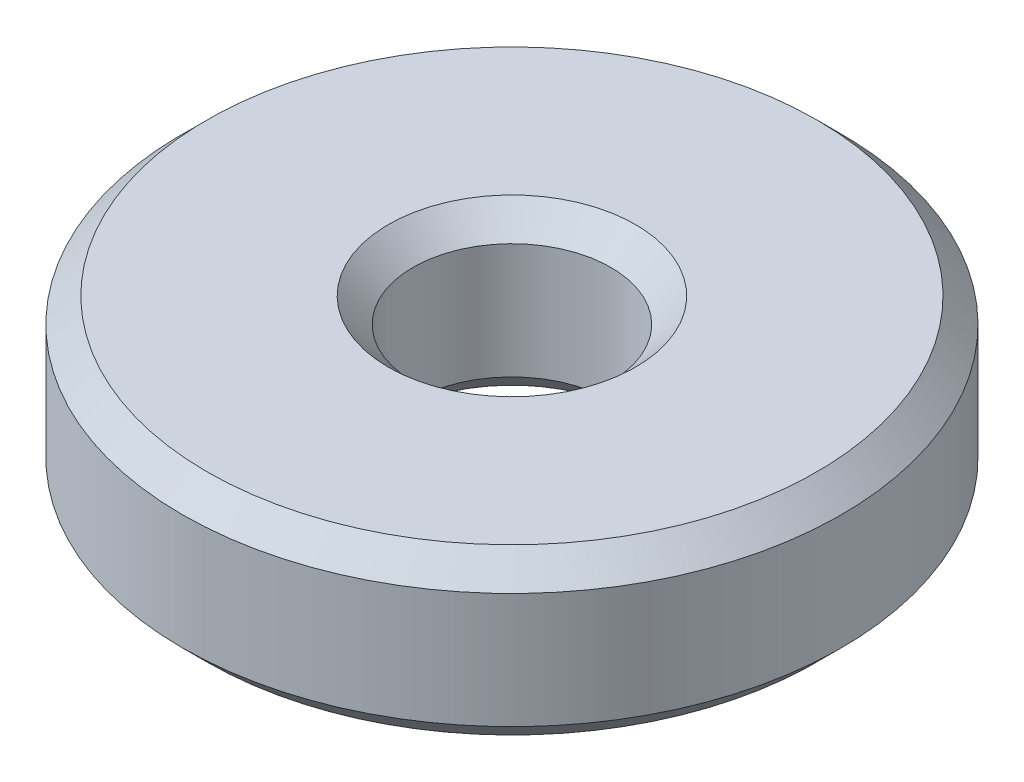
ISO-10303-21;
HEADER;
FILE_DESCRIPTION(('STEP AP214'),'2;1');
FILE_NAME('part.step','',(''),(''),'','','');
FILE_SCHEMA(('AUTOMOTIVE_DESIGN { 1 0 10303 214 1 1 1 1 }'));
ENDSEC;
DATA;
#1=APPLICATION_CONTEXT('core data for automotive mechanical design processes');
#2=APPLICATION_PROTOCOL_DEFINITION('international standard','automotive_design',2000,#1);
#3=PRODUCT_CONTEXT('',#1,'mechanical');
#4=PRODUCT('Part','Part','',(#3));
#5=PRODUCT_RELATED_PRODUCT_CATEGORY('part','',(#4));
#6=PRODUCT_DEFINITION_FORMATION('','',#4);
#7=PRODUCT_DEFINITION_CONTEXT('part definition',#1,'design');
#8=PRODUCT_DEFINITION('design','',#6,#7);
#9=PRODUCT_DEFINITION_SHAPE('','',#8);
#10=(LENGTH_UNIT() NAMED_UNIT(*) SI_UNIT(.MILLI.,.METRE.));
#11=(NAMED_UNIT(*) PLANE_ANGLE_UNIT() SI_UNIT($,.RADIAN.));
#12=(NAMED_UNIT(*) SI_UNIT($,.STERADIAN.) SOLID_ANGLE_UNIT());
#13=UNCERTAINTY_MEASURE_WITH_UNIT(LENGTH_MEASURE(1.E-05),#10,'distance_accuracy_value','');
#14=(GEOMETRIC_REPRESENTATION_CONTEXT(3) GLOBAL_UNCERTAINTY_ASSIGNED_CONTEXT((#13)) GLOBAL_UNIT_ASSIGNED_CONTEXT((#10,
#11,#12)) REPRESENTATION_CONTEXT('',''));
#15=CARTESIAN_POINT('',(0.,0.,0.));
#16=DIRECTION('',(0.,0.,1.));
#17=DIRECTION('',(1.,0.,0.));
#18=AXIS2_PLACEMENT_3D('',#15,#16,#17);
#19=CARTESIAN_POINT('',(0.,5.,0.));
#20=DIRECTION('',(0.,1.,0.));
#21=DIRECTION('',(0.,0.,1.));
#22=AXIS2_PLACEMENT_3D('',#19,#20,#21);
#23=PLANE('',#22);
#24=CARTESIAN_POINT('',(0.,5.,0.));
#25=DIRECTION('',(0.,1.,0.));
#26=DIRECTION('',(0.,0.,1.));
#27=AXIS2_PLACEMENT_3D('',#24,#25,#26);
#28=CIRCLE('',#27,3.75);
#29=CARTESIAN_POINT('',(0.,5.,3.75));
#30=VERTEX_POINT('',#29);
#31=EDGE_CURVE('E49',#30,#30,#28,.F.);
#32=ORIENTED_EDGE('',*,*,#31,.T.);
#33=EDGE_LOOP('',(#32));
#34=FACE_BOUND('',#33,.T.);
#35=CARTESIAN_POINT('',(0.,5.,0.));
#36=DIRECTION('',(0.,1.,0.));
#37=DIRECTION('',(0.,0.,1.));
#38=AXIS2_PLACEMENT_3D('',#35,#36,#37);
#39=CIRCLE('',#38,9.24999999999999);
#40=CARTESIAN_POINT('',(0.,5.,9.24999999999999));
#41=VERTEX_POINT('',#40);
#42=EDGE_CURVE('E54',#41,#41,#39,.T.);
#43=ORIENTED_EDGE('',*,*,#42,.T.);
#44=EDGE_LOOP('',(#43));
#45=FACE_BOUND('',#44,.T.);
#46=ADVANCED_FACE('F36',(#34,#45),#23,.T.);
#47=CARTESIAN_POINT('',(0.,0.,0.));
#48=DIRECTION('',(0.,1.,0.));
#49=DIRECTION('',(0.,0.,1.));
#50=AXIS2_PLACEMENT_3D('',#47,#48,#49);
#51=PLANE('',#50);
#52=CARTESIAN_POINT('',(0.,0.,0.));
#53=DIRECTION('',(0.,1.,0.));
#54=DIRECTION('',(0.,0.,1.));
#55=AXIS2_PLACEMENT_3D('',#52,#53,#54);
#56=CIRCLE('',#55,3.75);
#57=CARTESIAN_POINT('',(0.,0.,3.75));
#58=VERTEX_POINT('',#57);
#59=EDGE_CURVE('E68',#58,#58,#56,.T.);
#60=ORIENTED_EDGE('',*,*,#59,.T.);
#61=EDGE_LOOP('',(#60));
#62=FACE_BOUND('',#61,.T.);
#63=CARTESIAN_POINT('',(0.,0.,0.));
#64=DIRECTION('',(0.,1.,0.));
#65=DIRECTION('',(0.,0.,1.));
#66=AXIS2_PLACEMENT_3D('',#63,#64,#65);
#67=CIRCLE('',#66,9.25);
#68=CARTESIAN_POINT('',(0.,0.,9.25));
#69=VERTEX_POINT('',#68);
#70=EDGE_CURVE('E72',#69,#69,#67,.F.);
#71=ORIENTED_EDGE('',*,*,#70,.T.);
#72=EDGE_LOOP('',(#71));
#73=FACE_BOUND('',#72,.T.);
#74=ADVANCED_FACE('F77',(#62,#73),#51,.F.);
#75=CARTESIAN_POINT('',(0.,5.,0.));
#76=DIRECTION('',(0.,-1.,0.));
#77=DIRECTION('',(0.,0.,-1.));
#78=AXIS2_PLACEMENT_3D('',#75,#76,#77);
#79=CYLINDRICAL_SURFACE('',#78,10.);
#80=CARTESIAN_POINT('',(0.,0.749999999999997,0.));
#81=DIRECTION('',(0.,1.,0.));
#82=DIRECTION('',(0.,0.,1.));
#83=AXIS2_PLACEMENT_3D('',#80,#81,#82);
#84=CIRCLE('',#83,10.);
#85=CARTESIAN_POINT('',(0.,0.749999999999997,10.));
#86=VERTEX_POINT('',#85);
#87=EDGE_CURVE('E10',#86,#86,#84,.T.);
#88=ORIENTED_EDGE('',*,*,#87,.T.);
#89=EDGE_LOOP('',(#88));
#90=FACE_BOUND('',#89,.T.);
#91=CARTESIAN_POINT('',(0.,4.24999999999999,0.));
#92=DIRECTION('',(0.,1.,0.));
#93=DIRECTION('',(0.,0.,1.));
#94=AXIS2_PLACEMENT_3D('',#91,#92,#93);
#95=CIRCLE('',#94,10.);
#96=CARTESIAN_POINT('',(0.,4.24999999999999,10.));
#97=VERTEX_POINT('',#96);
#98=EDGE_CURVE('E44',#97,#97,#95,.F.);
#99=ORIENTED_EDGE('',*,*,#98,.T.);
#100=EDGE_LOOP('',(#99));
#101=FACE_BOUND('',#100,.T.);
#102=ADVANCED_FACE('F97',(#90,#101),#79,.T.);
#103=CARTESIAN_POINT('',(0.,5.,0.));
#104=DIRECTION('',(0.,-1.,0.));
#105=DIRECTION('',(0.,0.,-1.));
#106=AXIS2_PLACEMENT_3D('',#103,#104,#105);
#107=CYLINDRICAL_SURFACE('',#106,3.);
#108=CARTESIAN_POINT('',(0.,0.750000000000003,0.));
#109=DIRECTION('',(0.,1.,0.));
#110=DIRECTION('',(0.,0.,1.));
#111=AXIS2_PLACEMENT_3D('',#108,#109,#110);
#112=CIRCLE('',#111,3.);
#113=CARTESIAN_POINT('',(0.,0.750000000000003,3.));
#114=VERTEX_POINT('',#113);
#115=EDGE_CURVE('E60',#114,#114,#112,.F.);
#116=ORIENTED_EDGE('',*,*,#115,.T.);
#117=EDGE_LOOP('',(#116));
#118=FACE_BOUND('',#117,.T.);
#119=CARTESIAN_POINT('',(0.,4.25,0.));
#120=DIRECTION('',(0.,1.,0.));
#121=DIRECTION('',(0.,0.,1.));
#122=AXIS2_PLACEMENT_3D('',#119,#120,#121);
#123=CIRCLE('',#122,3.);
#124=CARTESIAN_POINT('',(0.,4.25,3.));
#125=VERTEX_POINT('',#124);
#126=EDGE_CURVE('E64',#125,#125,#123,.T.);
#127=ORIENTED_EDGE('',*,*,#126,.T.);
#128=EDGE_LOOP('',(#127));
#129=FACE_BOUND('',#128,.T.);
#130=ADVANCED_FACE('F102',(#118,#129),#107,.F.);
#131=CARTESIAN_POINT('',(0.,0.,0.));
#132=DIRECTION('',(0.,-1.,0.));
#133=DIRECTION('',(0.,0.,-1.));
#134=AXIS2_PLACEMENT_3D('',#131,#132,#133);
#135=CONICAL_SURFACE('',#134,3.75,0.785398163397446);
#136=ORIENTED_EDGE('',*,*,#115,.F.);
#137=EDGE_LOOP('',(#136));
#138=FACE_BOUND('',#137,.T.);
#139=ORIENTED_EDGE('',*,*,#59,.F.);
#140=EDGE_LOOP('',(#139));
#141=FACE_BOUND('',#140,.T.);
#142=ADVANCED_FACE('F88',(#138,#141),#135,.F.);
#143=CARTESIAN_POINT('',(0.,4.25,0.));
#144=DIRECTION('',(0.,1.,0.));
#145=DIRECTION('',(0.,0.,1.));
#146=AXIS2_PLACEMENT_3D('',#143,#144,#145);
#147=CONICAL_SURFACE('',#146,3.,0.78539816339745);
#148=ORIENTED_EDGE('',*,*,#31,.F.);
#149=EDGE_LOOP('',(#148));
#150=FACE_BOUND('',#149,.T.);
#151=ORIENTED_EDGE('',*,*,#126,.F.);
#152=EDGE_LOOP('',(#151));
#153=FACE_BOUND('',#152,.T.);
#154=ADVANCED_FACE('F82',(#150,#153),#147,.F.);
#155=CARTESIAN_POINT('',(0.,0.749999999999997,0.));
#156=DIRECTION('',(0.,1.,0.));
#157=DIRECTION('',(0.,0.,1.));
#158=AXIS2_PLACEMENT_3D('',#155,#156,#157);
#159=CONICAL_SURFACE('',#158,10.,0.785398163397452);
#160=ORIENTED_EDGE('',*,*,#70,.F.);
#161=EDGE_LOOP('',(#160));
#162=FACE_BOUND('',#161,.T.);
#163=ORIENTED_EDGE('',*,*,#87,.F.);
#164=EDGE_LOOP('',(#163));
#165=FACE_BOUND('',#164,.T.);
#166=ADVANCED_FACE('F79',(#162,#165),#159,.T.);
#167=CARTESIAN_POINT('',(0.,5.,0.));
#168=DIRECTION('',(0.,-1.,0.));
#169=DIRECTION('',(0.,0.,-1.));
#170=AXIS2_PLACEMENT_3D('',#167,#168,#169);
#171=CONICAL_SURFACE('',#170,9.24999999999999,0.785398163397445);
#172=ORIENTED_EDGE('',*,*,#98,.F.);
#173=EDGE_LOOP('',(#172));
#174=FACE_BOUND('',#173,.T.);
#175=ORIENTED_EDGE('',*,*,#42,.F.);
#176=EDGE_LOOP('',(#175));
#177=FACE_BOUND('',#176,.T.);
#178=ADVANCED_FACE('F38',(#174,#177),#171,.T.);
#179=CLOSED_SHELL('',(#46,#74,#102,#130,#142,#154,#166,#178));
#180=MANIFOLD_SOLID_BREP('B2',#179);
#181=ADVANCED_BREP_SHAPE_REPRESENTATION('',(#18,#180),#14);
#182=SHAPE_DEFINITION_REPRESENTATION(#9,#181);
ENDSEC;
END-ISO-10303-21;
